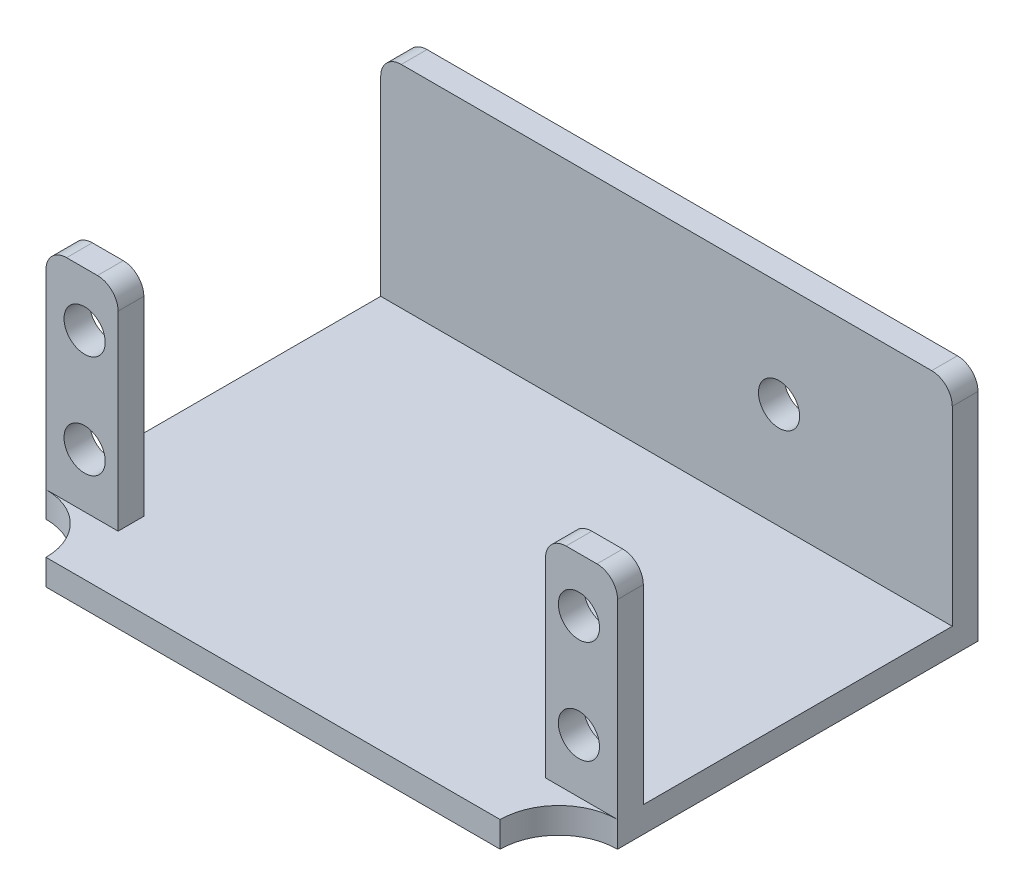
ISO-10303-21;
HEADER;
FILE_DESCRIPTION(('STEP AP214'),'2;1');
FILE_NAME('part.step','',(''),(''),'','','');
FILE_SCHEMA(('AUTOMOTIVE_DESIGN { 1 0 10303 214 1 1 1 1 }'));
ENDSEC;
DATA;
#1=APPLICATION_CONTEXT('core data for automotive mechanical design processes');
#2=APPLICATION_PROTOCOL_DEFINITION('international standard','automotive_design',2000,#1);
#3=PRODUCT_CONTEXT('',#1,'mechanical');
#4=PRODUCT('Part','Part','',(#3));
#5=PRODUCT_RELATED_PRODUCT_CATEGORY('part','',(#4));
#6=PRODUCT_DEFINITION_FORMATION('','',#4);
#7=PRODUCT_DEFINITION_CONTEXT('part definition',#1,'design');
#8=PRODUCT_DEFINITION('design','',#6,#7);
#9=PRODUCT_DEFINITION_SHAPE('','',#8);
#10=(LENGTH_UNIT() NAMED_UNIT(*) SI_UNIT(.MILLI.,.METRE.));
#11=(NAMED_UNIT(*) PLANE_ANGLE_UNIT() SI_UNIT($,.RADIAN.));
#12=(NAMED_UNIT(*) SI_UNIT($,.STERADIAN.) SOLID_ANGLE_UNIT());
#13=UNCERTAINTY_MEASURE_WITH_UNIT(LENGTH_MEASURE(1.E-05),#10,'distance_accuracy_value','');
#14=(GEOMETRIC_REPRESENTATION_CONTEXT(3) GLOBAL_UNCERTAINTY_ASSIGNED_CONTEXT((#13)) GLOBAL_UNIT_ASSIGNED_CONTEXT((#10,
#11,#12)) REPRESENTATION_CONTEXT('',''));
#15=CARTESIAN_POINT('',(0.,0.,0.));
#16=DIRECTION('',(0.,0.,1.));
#17=DIRECTION('',(1.,0.,0.));
#18=AXIS2_PLACEMENT_3D('',#15,#16,#17);
#19=CARTESIAN_POINT('',(0.,2.5,0.));
#20=DIRECTION('',(1.,0.,0.));
#21=DIRECTION('',(0.,0.,-1.));
#22=AXIS2_PLACEMENT_3D('',#19,#20,#21);
#23=PLANE('',#22);
#24=DIRECTION('',(0.,-1.,0.));
#25=VECTOR('',#24,1.);
#26=CARTESIAN_POINT('',(0.,2.5,-5.7));
#27=LINE('',#26,#25);
#28=CARTESIAN_POINT('',(0.,21.,-5.7));
#29=VERTEX_POINT('',#28);
#30=CARTESIAN_POINT('',(0.,2.5,-5.7));
#31=VERTEX_POINT('',#30);
#32=EDGE_CURVE('E256',#29,#31,#27,.T.);
#33=ORIENTED_EDGE('',*,*,#32,.F.);
#34=DIRECTION('',(0.,0.,-1.));
#35=VECTOR('',#34,1.);
#36=CARTESIAN_POINT('',(0.,21.,0.));
#37=LINE('',#36,#35);
#38=CARTESIAN_POINT('',(0.,21.,-8.2));
#39=VERTEX_POINT('',#38);
#40=EDGE_CURVE('E362',#29,#39,#37,.T.);
#41=ORIENTED_EDGE('',*,*,#40,.T.);
#42=DIRECTION('',(0.,-1.,0.));
#43=VECTOR('',#42,1.);
#44=CARTESIAN_POINT('',(0.,2.5,-8.2));
#45=LINE('',#44,#43);
#46=CARTESIAN_POINT('',(0.,2.5,-8.2));
#47=VERTEX_POINT('',#46);
#48=EDGE_CURVE('E255',#39,#47,#45,.T.);
#49=ORIENTED_EDGE('',*,*,#48,.T.);
#50=DIRECTION('',(0.,0.,1.));
#51=VECTOR('',#50,1.);
#52=CARTESIAN_POINT('',(0.,2.5,0.));
#53=LINE('',#52,#51);
#54=CARTESIAN_POINT('',(0.,2.5,-38.2));
#55=VERTEX_POINT('',#54);
#56=EDGE_CURVE('E289',#55,#47,#53,.T.);
#57=ORIENTED_EDGE('',*,*,#56,.F.);
#58=DIRECTION('',(0.,-1.,0.));
#59=VECTOR('',#58,1.);
#60=CARTESIAN_POINT('',(0.,78.5562777730834,-38.2));
#61=LINE('',#60,#59);
#62=CARTESIAN_POINT('',(0.,21.,-38.2));
#63=VERTEX_POINT('',#62);
#64=EDGE_CURVE('E404',#63,#55,#61,.T.);
#65=ORIENTED_EDGE('',*,*,#64,.F.);
#66=DIRECTION('',(0.,0.,-1.));
#67=VECTOR('',#66,1.);
#68=CARTESIAN_POINT('',(0.,21.,0.));
#69=LINE('',#68,#67);
#70=CARTESIAN_POINT('',(0.,21.,-40.7));
#71=VERTEX_POINT('',#70);
#72=EDGE_CURVE('E358',#63,#71,#69,.T.);
#73=ORIENTED_EDGE('',*,*,#72,.T.);
#74=DIRECTION('',(0.,-1.,0.));
#75=VECTOR('',#74,1.);
#76=CARTESIAN_POINT('',(0.,78.5562777730834,-40.7));
#77=LINE('',#76,#75);
#78=CARTESIAN_POINT('',(0.,0.,-40.7));
#79=VERTEX_POINT('',#78);
#80=EDGE_CURVE('E401',#71,#79,#77,.T.);
#81=ORIENTED_EDGE('',*,*,#80,.T.);
#82=DIRECTION('',(0.,0.,1.));
#83=VECTOR('',#82,1.);
#84=CARTESIAN_POINT('',(0.,0.,0.));
#85=LINE('',#84,#83);
#86=CARTESIAN_POINT('',(0.,0.,-5.7));
#87=VERTEX_POINT('',#86);
#88=EDGE_CURVE('E288',#79,#87,#85,.T.);
#89=ORIENTED_EDGE('',*,*,#88,.T.);
#90=DIRECTION('',(0.,1.,0.));
#91=VECTOR('',#90,1.);
#92=CARTESIAN_POINT('',(0.,0.,-5.7));
#93=LINE('',#92,#91);
#94=EDGE_CURVE('E416',#87,#31,#93,.T.);
#95=ORIENTED_EDGE('',*,*,#94,.T.);
#96=EDGE_LOOP('',(#33,#41,#49,#57,#65,#73,#81,#89,#95));
#97=FACE_BOUND('',#96,.T.);
#98=ADVANCED_FACE('F41',(#97),#23,.F.);
#99=CARTESIAN_POINT('',(0.,2.5,0.));
#100=DIRECTION('',(0.,0.,-1.));
#101=DIRECTION('',(-1.,0.,0.));
#102=AXIS2_PLACEMENT_3D('',#99,#100,#101);
#103=PLANE('',#102);
#104=DIRECTION('',(1.,0.,0.));
#105=VECTOR('',#104,1.);
#106=CARTESIAN_POINT('',(0.,2.5,0.));
#107=LINE('',#106,#105);
#108=CARTESIAN_POINT('',(5.7,2.5,0.));
#109=VERTEX_POINT('',#108);
#110=CARTESIAN_POINT('',(49.8,2.5,0.));
#111=VERTEX_POINT('',#110);
#112=EDGE_CURVE('E210',#109,#111,#107,.T.);
#113=ORIENTED_EDGE('',*,*,#112,.F.);
#114=DIRECTION('',(0.,1.,0.));
#115=VECTOR('',#114,1.);
#116=CARTESIAN_POINT('',(5.7,0.,0.));
#117=LINE('',#116,#115);
#118=CARTESIAN_POINT('',(5.7,0.,0.));
#119=VERTEX_POINT('',#118);
#120=EDGE_CURVE('E490',#109,#119,#117,.F.);
#121=ORIENTED_EDGE('',*,*,#120,.T.);
#122=DIRECTION('',(1.,0.,0.));
#123=VECTOR('',#122,1.);
#124=CARTESIAN_POINT('',(0.,0.,0.));
#125=LINE('',#124,#123);
#126=CARTESIAN_POINT('',(49.8,0.,0.));
#127=VERTEX_POINT('',#126);
#128=EDGE_CURVE('E308',#119,#127,#125,.T.);
#129=ORIENTED_EDGE('',*,*,#128,.T.);
#130=DIRECTION('',(0.,1.,0.));
#131=VECTOR('',#130,1.);
#132=CARTESIAN_POINT('',(49.8,0.,0.));
#133=LINE('',#132,#131);
#134=EDGE_CURVE('E196',#127,#111,#133,.T.);
#135=ORIENTED_EDGE('',*,*,#134,.T.);
#136=EDGE_LOOP('',(#113,#121,#129,#135));
#137=FACE_BOUND('',#136,.T.);
#138=ADVANCED_FACE('F506',(#137),#103,.F.);
#139=CARTESIAN_POINT('',(55.5,2.5,0.));
#140=DIRECTION('',(-1.,0.,0.));
#141=DIRECTION('',(0.,0.,1.));
#142=AXIS2_PLACEMENT_3D('',#139,#140,#141);
#143=PLANE('',#142);
#144=DIRECTION('',(0.,1.,0.));
#145=VECTOR('',#144,1.);
#146=CARTESIAN_POINT('',(55.5,2.5,-8.2));
#147=LINE('',#146,#145);
#148=CARTESIAN_POINT('',(55.5,2.5,-8.2));
#149=VERTEX_POINT('',#148);
#150=CARTESIAN_POINT('',(55.5,21.,-8.2));
#151=VERTEX_POINT('',#150);
#152=EDGE_CURVE('E243',#149,#151,#147,.T.);
#153=ORIENTED_EDGE('',*,*,#152,.T.);
#154=DIRECTION('',(0.,0.,-1.));
#155=VECTOR('',#154,1.);
#156=CARTESIAN_POINT('',(55.5,21.,0.));
#157=LINE('',#156,#155);
#158=CARTESIAN_POINT('',(55.5,21.,-5.7));
#159=VERTEX_POINT('',#158);
#160=EDGE_CURVE('E227',#151,#159,#157,.F.);
#161=ORIENTED_EDGE('',*,*,#160,.T.);
#162=DIRECTION('',(0.,1.,0.));
#163=VECTOR('',#162,1.);
#164=CARTESIAN_POINT('',(55.5,2.5,-5.7));
#165=LINE('',#164,#163);
#166=CARTESIAN_POINT('',(55.5,2.5,-5.7));
#167=VERTEX_POINT('',#166);
#168=EDGE_CURVE('E217',#167,#159,#165,.T.);
#169=ORIENTED_EDGE('',*,*,#168,.F.);
#170=DIRECTION('',(0.,1.,0.));
#171=VECTOR('',#170,1.);
#172=CARTESIAN_POINT('',(55.5,0.,-5.7));
#173=LINE('',#172,#171);
#174=CARTESIAN_POINT('',(55.5,0.,-5.7));
#175=VERTEX_POINT('',#174);
#176=EDGE_CURVE('E184',#167,#175,#173,.F.);
#177=ORIENTED_EDGE('',*,*,#176,.T.);
#178=DIRECTION('',(0.,0.,-1.));
#179=VECTOR('',#178,1.);
#180=CARTESIAN_POINT('',(55.5,0.,0.));
#181=LINE('',#180,#179);
#182=CARTESIAN_POINT('',(55.5,0.,-40.7));
#183=VERTEX_POINT('',#182);
#184=EDGE_CURVE('E293',#175,#183,#181,.T.);
#185=ORIENTED_EDGE('',*,*,#184,.T.);
#186=DIRECTION('',(0.,-1.,0.));
#187=VECTOR('',#186,1.);
#188=CARTESIAN_POINT('',(55.5,78.5562777730834,-40.7));
#189=LINE('',#188,#187);
#190=CARTESIAN_POINT('',(55.5,21.,-40.7));
#191=VERTEX_POINT('',#190);
#192=EDGE_CURVE('E410',#191,#183,#189,.T.);
#193=ORIENTED_EDGE('',*,*,#192,.F.);
#194=DIRECTION('',(0.,0.,1.));
#195=VECTOR('',#194,1.);
#196=CARTESIAN_POINT('',(55.5,21.,0.));
#197=LINE('',#196,#195);
#198=CARTESIAN_POINT('',(55.5,21.,-38.2));
#199=VERTEX_POINT('',#198);
#200=EDGE_CURVE('E366',#191,#199,#197,.T.);
#201=ORIENTED_EDGE('',*,*,#200,.T.);
#202=DIRECTION('',(0.,-1.,0.));
#203=VECTOR('',#202,1.);
#204=CARTESIAN_POINT('',(55.5,78.5562777730834,-38.2));
#205=LINE('',#204,#203);
#206=CARTESIAN_POINT('',(55.5,2.5,-38.2));
#207=VERTEX_POINT('',#206);
#208=EDGE_CURVE('E414',#199,#207,#205,.T.);
#209=ORIENTED_EDGE('',*,*,#208,.T.);
#210=DIRECTION('',(0.,0.,-1.));
#211=VECTOR('',#210,1.);
#212=CARTESIAN_POINT('',(55.5,2.5,0.));
#213=LINE('',#212,#211);
#214=EDGE_CURVE('E296',#149,#207,#213,.T.);
#215=ORIENTED_EDGE('',*,*,#214,.F.);
#216=EDGE_LOOP('',(#153,#161,#169,#177,#185,#193,#201,#209,#215));
#217=FACE_BOUND('',#216,.T.);
#218=ADVANCED_FACE('F225',(#217),#143,.F.);
#219=CARTESIAN_POINT('',(0.,2.5,0.));
#220=DIRECTION('',(0.,-1.,0.));
#221=DIRECTION('',(0.,0.,-1.));
#222=AXIS2_PLACEMENT_3D('',#219,#220,#221);
#223=PLANE('',#222);
#224=DIRECTION('',(1.,0.,0.));
#225=VECTOR('',#224,1.);
#226=CARTESIAN_POINT('',(0.,2.5,-5.7));
#227=LINE('',#226,#225);
#228=CARTESIAN_POINT('',(7.,2.5,-5.7));
#229=VERTEX_POINT('',#228);
#230=EDGE_CURVE('E259',#31,#229,#227,.T.);
#231=ORIENTED_EDGE('',*,*,#230,.F.);
#232=CARTESIAN_POINT('',(0.,2.5,0.));
#233=DIRECTION('',(0.,1.,0.));
#234=DIRECTION('',(0.,0.,1.));
#235=AXIS2_PLACEMENT_3D('',#232,#233,#234);
#236=CIRCLE('',#235,5.7);
#237=EDGE_CURVE('E486',#109,#31,#236,.T.);
#238=ORIENTED_EDGE('',*,*,#237,.F.);
#239=ORIENTED_EDGE('',*,*,#112,.T.);
#240=CARTESIAN_POINT('',(55.5,2.5,0.));
#241=DIRECTION('',(0.,1.,0.));
#242=DIRECTION('',(0.,0.,1.));
#243=AXIS2_PLACEMENT_3D('',#240,#241,#242);
#244=CIRCLE('',#243,5.7);
#245=EDGE_CURVE('E187',#167,#111,#244,.T.);
#246=ORIENTED_EDGE('',*,*,#245,.F.);
#247=DIRECTION('',(1.,0.,0.));
#248=VECTOR('',#247,1.);
#249=CARTESIAN_POINT('',(55.5,2.5,-5.7));
#250=LINE('',#249,#248);
#251=CARTESIAN_POINT('',(48.5,2.5,-5.7));
#252=VERTEX_POINT('',#251);
#253=EDGE_CURVE('E206',#252,#167,#250,.T.);
#254=ORIENTED_EDGE('',*,*,#253,.F.);
#255=DIRECTION('',(0.,0.,-1.));
#256=VECTOR('',#255,1.);
#257=CARTESIAN_POINT('',(48.5,2.5,-5.7));
#258=LINE('',#257,#256);
#259=CARTESIAN_POINT('',(48.5,2.5,-8.2));
#260=VERTEX_POINT('',#259);
#261=EDGE_CURVE('E222',#252,#260,#258,.T.);
#262=ORIENTED_EDGE('',*,*,#261,.T.);
#263=DIRECTION('',(1.,0.,0.));
#264=VECTOR('',#263,1.);
#265=CARTESIAN_POINT('',(55.5,2.5,-8.2));
#266=LINE('',#265,#264);
#267=EDGE_CURVE('E230',#260,#149,#266,.T.);
#268=ORIENTED_EDGE('',*,*,#267,.T.);
#269=ORIENTED_EDGE('',*,*,#214,.T.);
#270=DIRECTION('',(-1.,0.,0.));
#271=VECTOR('',#270,1.);
#272=CARTESIAN_POINT('',(0.,2.5,-38.2));
#273=LINE('',#272,#271);
#274=EDGE_CURVE('E300',#207,#55,#273,.T.);
#275=ORIENTED_EDGE('',*,*,#274,.T.);
#276=ORIENTED_EDGE('',*,*,#56,.T.);
#277=DIRECTION('',(1.,0.,0.));
#278=VECTOR('',#277,1.);
#279=CARTESIAN_POINT('',(0.,2.5,-8.2));
#280=LINE('',#279,#278);
#281=CARTESIAN_POINT('',(7.,2.5,-8.2));
#282=VERTEX_POINT('',#281);
#283=EDGE_CURVE('E275',#47,#282,#280,.T.);
#284=ORIENTED_EDGE('',*,*,#283,.T.);
#285=DIRECTION('',(0.,0.,-1.));
#286=VECTOR('',#285,1.);
#287=CARTESIAN_POINT('',(7.,2.5,-5.7));
#288=LINE('',#287,#286);
#289=EDGE_CURVE('E272',#229,#282,#288,.T.);
#290=ORIENTED_EDGE('',*,*,#289,.F.);
#291=EDGE_LOOP('',(#231,#238,#239,#246,#254,#262,#268,#269,#275,#276,#284,#290));
#292=FACE_BOUND('',#291,.T.);
#293=ADVANCED_FACE('F204',(#292),#223,.F.);
#294=CARTESIAN_POINT('',(0.,0.,0.));
#295=DIRECTION('',(0.,-1.,0.));
#296=DIRECTION('',(0.,0.,-1.));
#297=AXIS2_PLACEMENT_3D('',#294,#295,#296);
#298=PLANE('',#297);
#299=CARTESIAN_POINT('',(0.,0.,0.));
#300=DIRECTION('',(0.,1.,0.));
#301=DIRECTION('',(0.,0.,1.));
#302=AXIS2_PLACEMENT_3D('',#299,#300,#301);
#303=CIRCLE('',#302,5.7);
#304=EDGE_CURVE('E197',#119,#87,#303,.T.);
#305=ORIENTED_EDGE('',*,*,#304,.T.);
#306=ORIENTED_EDGE('',*,*,#88,.F.);
#307=DIRECTION('',(-1.,0.,0.));
#308=VECTOR('',#307,1.);
#309=CARTESIAN_POINT('',(0.,0.,-40.7));
#310=LINE('',#309,#308);
#311=EDGE_CURVE('E408',#183,#79,#310,.T.);
#312=ORIENTED_EDGE('',*,*,#311,.F.);
#313=ORIENTED_EDGE('',*,*,#184,.F.);
#314=CARTESIAN_POINT('',(55.5,0.,0.));
#315=DIRECTION('',(0.,1.,0.));
#316=DIRECTION('',(0.,0.,1.));
#317=AXIS2_PLACEMENT_3D('',#314,#315,#316);
#318=CIRCLE('',#317,5.7);
#319=EDGE_CURVE('E190',#175,#127,#318,.T.);
#320=ORIENTED_EDGE('',*,*,#319,.T.);
#321=ORIENTED_EDGE('',*,*,#128,.F.);
#322=EDGE_LOOP('',(#305,#306,#312,#313,#320,#321));
#323=FACE_BOUND('',#322,.T.);
#324=ADVANCED_FACE('F508',(#323),#298,.T.);
#325=CARTESIAN_POINT('',(7.,2.5,-5.7));
#326=DIRECTION('',(-1.,0.,0.));
#327=DIRECTION('',(0.,0.,1.));
#328=AXIS2_PLACEMENT_3D('',#325,#326,#327);
#329=PLANE('',#328);
#330=DIRECTION('',(0.,1.,0.));
#331=VECTOR('',#330,1.);
#332=CARTESIAN_POINT('',(7.,2.5,-8.2));
#333=LINE('',#332,#331);
#334=CARTESIAN_POINT('',(7.,21.,-8.2));
#335=VERTEX_POINT('',#334);
#336=EDGE_CURVE('E278',#282,#335,#333,.T.);
#337=ORIENTED_EDGE('',*,*,#336,.T.);
#338=DIRECTION('',(0.,0.,-1.));
#339=VECTOR('',#338,1.);
#340=CARTESIAN_POINT('',(7.,21.,-5.7));
#341=LINE('',#340,#339);
#342=CARTESIAN_POINT('',(7.,21.,-5.7));
#343=VERTEX_POINT('',#342);
#344=EDGE_CURVE('E326',#335,#343,#341,.F.);
#345=ORIENTED_EDGE('',*,*,#344,.T.);
#346=DIRECTION('',(0.,1.,0.));
#347=VECTOR('',#346,1.);
#348=CARTESIAN_POINT('',(7.,2.5,-5.7));
#349=LINE('',#348,#347);
#350=EDGE_CURVE('E264',#229,#343,#349,.T.);
#351=ORIENTED_EDGE('',*,*,#350,.F.);
#352=ORIENTED_EDGE('',*,*,#289,.T.);
#353=EDGE_LOOP('',(#337,#345,#351,#352));
#354=FACE_BOUND('',#353,.T.);
#355=ADVANCED_FACE('F709',(#354),#329,.F.);
#356=CARTESIAN_POINT('',(0.,23.,-5.7));
#357=DIRECTION('',(0.,-1.,0.));
#358=DIRECTION('',(0.,0.,-1.));
#359=AXIS2_PLACEMENT_3D('',#356,#357,#358);
#360=PLANE('',#359);
#361=DIRECTION('',(-1.,0.,0.));
#362=VECTOR('',#361,1.);
#363=CARTESIAN_POINT('',(0.,23.,-5.7));
#364=LINE('',#363,#362);
#365=CARTESIAN_POINT('',(5.,23.,-5.7));
#366=VERTEX_POINT('',#365);
#367=CARTESIAN_POINT('',(2.,23.,-5.7));
#368=VERTEX_POINT('',#367);
#369=EDGE_CURVE('E268',#366,#368,#364,.T.);
#370=ORIENTED_EDGE('',*,*,#369,.F.);
#371=DIRECTION('',(0.,0.,-1.));
#372=VECTOR('',#371,1.);
#373=CARTESIAN_POINT('',(5.,23.,-5.7));
#374=LINE('',#373,#372);
#375=CARTESIAN_POINT('',(5.,23.,-8.2));
#376=VERTEX_POINT('',#375);
#377=EDGE_CURVE('E316',#366,#376,#374,.T.);
#378=ORIENTED_EDGE('',*,*,#377,.T.);
#379=DIRECTION('',(-1.,0.,0.));
#380=VECTOR('',#379,1.);
#381=CARTESIAN_POINT('',(0.,23.,-8.2));
#382=LINE('',#381,#380);
#383=CARTESIAN_POINT('',(2.,23.,-8.2));
#384=VERTEX_POINT('',#383);
#385=EDGE_CURVE('E260',#376,#384,#382,.T.);
#386=ORIENTED_EDGE('',*,*,#385,.T.);
#387=DIRECTION('',(0.,0.,-1.));
#388=VECTOR('',#387,1.);
#389=CARTESIAN_POINT('',(2.,23.,-5.7));
#390=LINE('',#389,#388);
#391=EDGE_CURVE('E304',#384,#368,#390,.F.);
#392=ORIENTED_EDGE('',*,*,#391,.T.);
#393=EDGE_LOOP('',(#370,#378,#386,#392));
#394=FACE_BOUND('',#393,.T.);
#395=ADVANCED_FACE('F461',(#394),#360,.F.);
#396=CARTESIAN_POINT('',(0.,0.,-5.7));
#397=DIRECTION('',(0.,0.,-1.));
#398=DIRECTION('',(-1.,0.,0.));
#399=AXIS2_PLACEMENT_3D('',#396,#397,#398);
#400=PLANE('',#399);
#401=CARTESIAN_POINT('',(3.75,7.75,-5.7));
#402=DIRECTION('',(0.,0.,1.));
#403=DIRECTION('',(-1.,0.,0.));
#404=AXIS2_PLACEMENT_3D('',#401,#402,#403);
#405=CIRCLE('',#404,2.);
#406=CARTESIAN_POINT('',(1.75,7.75,-5.7));
#407=VERTEX_POINT('',#406);
#408=EDGE_CURVE('E429',#407,#407,#405,.T.);
#409=ORIENTED_EDGE('',*,*,#408,.F.);
#410=EDGE_LOOP('',(#409));
#411=FACE_BOUND('',#410,.T.);
#412=CARTESIAN_POINT('',(3.75,17.75,-5.7));
#413=DIRECTION('',(0.,0.,1.));
#414=DIRECTION('',(1.,0.,0.));
#415=AXIS2_PLACEMENT_3D('',#412,#413,#414);
#416=CIRCLE('',#415,2.);
#417=CARTESIAN_POINT('',(5.75,17.75,-5.7));
#418=VERTEX_POINT('',#417);
#419=EDGE_CURVE('E238',#418,#418,#416,.T.);
#420=ORIENTED_EDGE('',*,*,#419,.F.);
#421=EDGE_LOOP('',(#420));
#422=FACE_BOUND('',#421,.T.);
#423=ORIENTED_EDGE('',*,*,#350,.T.);
#424=CARTESIAN_POINT('',(5.,21.,-5.7));
#425=DIRECTION('',(0.,0.,-1.));
#426=DIRECTION('',(-1.,0.,0.));
#427=AXIS2_PLACEMENT_3D('',#424,#425,#426);
#428=CIRCLE('',#427,2.);
#429=EDGE_CURVE('E332',#343,#366,#428,.F.);
#430=ORIENTED_EDGE('',*,*,#429,.T.);
#431=ORIENTED_EDGE('',*,*,#369,.T.);
#432=CARTESIAN_POINT('',(2.,21.,-5.7));
#433=DIRECTION('',(0.,0.,-1.));
#434=DIRECTION('',(-1.,0.,0.));
#435=AXIS2_PLACEMENT_3D('',#432,#433,#434);
#436=CIRCLE('',#435,2.);
#437=EDGE_CURVE('E329',#368,#29,#436,.F.);
#438=ORIENTED_EDGE('',*,*,#437,.T.);
#439=ORIENTED_EDGE('',*,*,#32,.T.);
#440=ORIENTED_EDGE('',*,*,#230,.T.);
#441=EDGE_LOOP('',(#423,#430,#431,#438,#439,#440));
#442=FACE_BOUND('',#441,.T.);
#443=ADVANCED_FACE('F457',(#411,#422,#442),#400,.F.);
#444=CARTESIAN_POINT('',(0.,0.,-8.2));
#445=DIRECTION('',(0.,0.,-1.));
#446=DIRECTION('',(-1.,0.,0.));
#447=AXIS2_PLACEMENT_3D('',#444,#445,#446);
#448=PLANE('',#447);
#449=CARTESIAN_POINT('',(3.75,7.75,-8.2));
#450=DIRECTION('',(0.,0.,1.));
#451=DIRECTION('',(-1.,0.,0.));
#452=AXIS2_PLACEMENT_3D('',#449,#450,#451);
#453=CIRCLE('',#452,2.);
#454=CARTESIAN_POINT('',(1.75,7.75,-8.2));
#455=VERTEX_POINT('',#454);
#456=EDGE_CURVE('E425',#455,#455,#453,.T.);
#457=ORIENTED_EDGE('',*,*,#456,.T.);
#458=EDGE_LOOP('',(#457));
#459=FACE_BOUND('',#458,.T.);
#460=CARTESIAN_POINT('',(3.75,17.75,-8.2));
#461=DIRECTION('',(0.,0.,1.));
#462=DIRECTION('',(1.,0.,0.));
#463=AXIS2_PLACEMENT_3D('',#460,#461,#462);
#464=CIRCLE('',#463,2.);
#465=CARTESIAN_POINT('',(5.75,17.75,-8.2));
#466=VERTEX_POINT('',#465);
#467=EDGE_CURVE('E247',#466,#466,#464,.T.);
#468=ORIENTED_EDGE('',*,*,#467,.T.);
#469=EDGE_LOOP('',(#468));
#470=FACE_BOUND('',#469,.T.);
#471=ORIENTED_EDGE('',*,*,#385,.F.);
#472=CARTESIAN_POINT('',(5.,21.,-8.2));
#473=DIRECTION('',(0.,0.,-1.));
#474=DIRECTION('',(-1.,0.,0.));
#475=AXIS2_PLACEMENT_3D('',#472,#473,#474);
#476=CIRCLE('',#475,2.);
#477=EDGE_CURVE('E323',#376,#335,#476,.T.);
#478=ORIENTED_EDGE('',*,*,#477,.T.);
#479=ORIENTED_EDGE('',*,*,#336,.F.);
#480=ORIENTED_EDGE('',*,*,#283,.F.);
#481=ORIENTED_EDGE('',*,*,#48,.F.);
#482=CARTESIAN_POINT('',(2.,21.,-8.2));
#483=DIRECTION('',(0.,0.,-1.));
#484=DIRECTION('',(-1.,0.,0.));
#485=AXIS2_PLACEMENT_3D('',#482,#483,#484);
#486=CIRCLE('',#485,2.);
#487=EDGE_CURVE('E320',#39,#384,#486,.T.);
#488=ORIENTED_EDGE('',*,*,#487,.T.);
#489=EDGE_LOOP('',(#471,#478,#479,#480,#481,#488));
#490=FACE_BOUND('',#489,.T.);
#491=ADVANCED_FACE('F460',(#459,#470,#490),#448,.T.);
#492=CARTESIAN_POINT('',(55.5,23.,-5.7));
#493=DIRECTION('',(0.,-1.,0.));
#494=DIRECTION('',(0.,0.,-1.));
#495=AXIS2_PLACEMENT_3D('',#492,#493,#494);
#496=PLANE('',#495);
#497=DIRECTION('',(-1.,0.,0.));
#498=VECTOR('',#497,1.);
#499=CARTESIAN_POINT('',(55.5,23.,-8.2));
#500=LINE('',#499,#498);
#501=CARTESIAN_POINT('',(53.5,23.,-8.2));
#502=VERTEX_POINT('',#501);
#503=CARTESIAN_POINT('',(50.5,23.,-8.2));
#504=VERTEX_POINT('',#503);
#505=EDGE_CURVE('E246',#502,#504,#500,.T.);
#506=ORIENTED_EDGE('',*,*,#505,.T.);
#507=DIRECTION('',(0.,0.,-1.));
#508=VECTOR('',#507,1.);
#509=CARTESIAN_POINT('',(50.5,23.,-5.7));
#510=LINE('',#509,#508);
#511=CARTESIAN_POINT('',(50.5,23.,-5.7));
#512=VERTEX_POINT('',#511);
#513=EDGE_CURVE('E349',#504,#512,#510,.F.);
#514=ORIENTED_EDGE('',*,*,#513,.T.);
#515=DIRECTION('',(-1.,0.,0.));
#516=VECTOR('',#515,1.);
#517=CARTESIAN_POINT('',(55.5,23.,-5.7));
#518=LINE('',#517,#516);
#519=CARTESIAN_POINT('',(53.5,23.,-5.7));
#520=VERTEX_POINT('',#519);
#521=EDGE_CURVE('E229',#520,#512,#518,.T.);
#522=ORIENTED_EDGE('',*,*,#521,.F.);
#523=DIRECTION('',(0.,0.,-1.));
#524=VECTOR('',#523,1.);
#525=CARTESIAN_POINT('',(53.5,23.,-5.7));
#526=LINE('',#525,#524);
#527=EDGE_CURVE('E345',#520,#502,#526,.T.);
#528=ORIENTED_EDGE('',*,*,#527,.T.);
#529=EDGE_LOOP('',(#506,#514,#522,#528));
#530=FACE_BOUND('',#529,.T.);
#531=ADVANCED_FACE('F683',(#530),#496,.F.);
#532=CARTESIAN_POINT('',(48.5,2.5,-5.7));
#533=DIRECTION('',(1.,0.,0.));
#534=DIRECTION('',(0.,0.,-1.));
#535=AXIS2_PLACEMENT_3D('',#532,#533,#534);
#536=PLANE('',#535);
#537=DIRECTION('',(0.,-1.,0.));
#538=VECTOR('',#537,1.);
#539=CARTESIAN_POINT('',(48.5,2.5,-5.7));
#540=LINE('',#539,#538);
#541=CARTESIAN_POINT('',(48.5,21.,-5.7));
#542=VERTEX_POINT('',#541);
#543=EDGE_CURVE('E220',#542,#252,#540,.T.);
#544=ORIENTED_EDGE('',*,*,#543,.F.);
#545=DIRECTION('',(0.,0.,-1.));
#546=VECTOR('',#545,1.);
#547=CARTESIAN_POINT('',(48.5,21.,-5.7));
#548=LINE('',#547,#546);
#549=CARTESIAN_POINT('',(48.5,21.,-8.2));
#550=VERTEX_POINT('',#549);
#551=EDGE_CURVE('E335',#542,#550,#548,.T.);
#552=ORIENTED_EDGE('',*,*,#551,.T.);
#553=DIRECTION('',(0.,-1.,0.));
#554=VECTOR('',#553,1.);
#555=CARTESIAN_POINT('',(48.5,2.5,-8.2));
#556=LINE('',#555,#554);
#557=EDGE_CURVE('E235',#550,#260,#556,.T.);
#558=ORIENTED_EDGE('',*,*,#557,.T.);
#559=ORIENTED_EDGE('',*,*,#261,.F.);
#560=EDGE_LOOP('',(#544,#552,#558,#559));
#561=FACE_BOUND('',#560,.T.);
#562=ADVANCED_FACE('F675',(#561),#536,.F.);
#563=CARTESIAN_POINT('',(0.,0.,-5.7));
#564=DIRECTION('',(0.,0.,1.));
#565=DIRECTION('',(1.,0.,0.));
#566=AXIS2_PLACEMENT_3D('',#563,#564,#565);
#567=PLANE('',#566);
#568=CARTESIAN_POINT('',(51.75,17.75,-5.7));
#569=DIRECTION('',(0.,0.,1.));
#570=DIRECTION('',(-1.,0.,0.));
#571=AXIS2_PLACEMENT_3D('',#568,#569,#570);
#572=CIRCLE('',#571,2.);
#573=CARTESIAN_POINT('',(49.75,17.75,-5.7));
#574=VERTEX_POINT('',#573);
#575=EDGE_CURVE('E396',#574,#574,#572,.T.);
#576=ORIENTED_EDGE('',*,*,#575,.F.);
#577=EDGE_LOOP('',(#576));
#578=FACE_BOUND('',#577,.T.);
#579=CARTESIAN_POINT('',(51.75,7.75,-5.7));
#580=DIRECTION('',(0.,0.,1.));
#581=DIRECTION('',(1.,0.,0.));
#582=AXIS2_PLACEMENT_3D('',#579,#580,#581);
#583=CIRCLE('',#582,2.);
#584=CARTESIAN_POINT('',(53.75,7.75,-5.7));
#585=VERTEX_POINT('',#584);
#586=EDGE_CURVE('E437',#585,#585,#583,.T.);
#587=ORIENTED_EDGE('',*,*,#586,.F.);
#588=EDGE_LOOP('',(#587));
#589=FACE_BOUND('',#588,.T.);
#590=ORIENTED_EDGE('',*,*,#521,.T.);
#591=CARTESIAN_POINT('',(50.5,21.,-5.7));
#592=DIRECTION('',(0.,0.,1.));
#593=DIRECTION('',(1.,0.,0.));
#594=AXIS2_PLACEMENT_3D('',#591,#592,#593);
#595=CIRCLE('',#594,2.);
#596=EDGE_CURVE('E355',#512,#542,#595,.T.);
#597=ORIENTED_EDGE('',*,*,#596,.T.);
#598=ORIENTED_EDGE('',*,*,#543,.T.);
#599=ORIENTED_EDGE('',*,*,#253,.T.);
#600=ORIENTED_EDGE('',*,*,#168,.T.);
#601=CARTESIAN_POINT('',(53.5,21.,-5.7));
#602=DIRECTION('',(0.,0.,1.));
#603=DIRECTION('',(1.,0.,0.));
#604=AXIS2_PLACEMENT_3D('',#601,#602,#603);
#605=CIRCLE('',#604,2.);
#606=EDGE_CURVE('E352',#159,#520,#605,.T.);
#607=ORIENTED_EDGE('',*,*,#606,.T.);
#608=EDGE_LOOP('',(#590,#597,#598,#599,#600,#607));
#609=FACE_BOUND('',#608,.T.);
#610=ADVANCED_FACE('F216',(#578,#589,#609),#567,.T.);
#611=CARTESIAN_POINT('',(0.,0.,-8.2));
#612=DIRECTION('',(0.,0.,1.));
#613=DIRECTION('',(1.,0.,0.));
#614=AXIS2_PLACEMENT_3D('',#611,#612,#613);
#615=PLANE('',#614);
#616=CARTESIAN_POINT('',(51.75,17.75,-8.2));
#617=DIRECTION('',(0.,0.,1.));
#618=DIRECTION('',(-1.,0.,0.));
#619=AXIS2_PLACEMENT_3D('',#616,#617,#618);
#620=CIRCLE('',#619,2.);
#621=CARTESIAN_POINT('',(49.75,17.75,-8.2));
#622=VERTEX_POINT('',#621);
#623=EDGE_CURVE('E441',#622,#622,#620,.T.);
#624=ORIENTED_EDGE('',*,*,#623,.T.);
#625=EDGE_LOOP('',(#624));
#626=FACE_BOUND('',#625,.T.);
#627=CARTESIAN_POINT('',(51.75,7.75,-8.2));
#628=DIRECTION('',(0.,0.,1.));
#629=DIRECTION('',(1.,0.,0.));
#630=AXIS2_PLACEMENT_3D('',#627,#628,#629);
#631=CIRCLE('',#630,2.);
#632=CARTESIAN_POINT('',(53.75,7.75,-8.2));
#633=VERTEX_POINT('',#632);
#634=EDGE_CURVE('E433',#633,#633,#631,.T.);
#635=ORIENTED_EDGE('',*,*,#634,.T.);
#636=EDGE_LOOP('',(#635));
#637=FACE_BOUND('',#636,.T.);
#638=ORIENTED_EDGE('',*,*,#557,.F.);
#639=CARTESIAN_POINT('',(50.5,21.,-8.2));
#640=DIRECTION('',(0.,0.,1.));
#641=DIRECTION('',(1.,0.,0.));
#642=AXIS2_PLACEMENT_3D('',#639,#640,#641);
#643=CIRCLE('',#642,2.);
#644=EDGE_CURVE('E342',#550,#504,#643,.F.);
#645=ORIENTED_EDGE('',*,*,#644,.T.);
#646=ORIENTED_EDGE('',*,*,#505,.F.);
#647=CARTESIAN_POINT('',(53.5,21.,-8.2));
#648=DIRECTION('',(0.,0.,1.));
#649=DIRECTION('',(1.,0.,0.));
#650=AXIS2_PLACEMENT_3D('',#647,#648,#649);
#651=CIRCLE('',#650,2.);
#652=EDGE_CURVE('E339',#502,#151,#651,.F.);
#653=ORIENTED_EDGE('',*,*,#652,.T.);
#654=ORIENTED_EDGE('',*,*,#152,.F.);
#655=ORIENTED_EDGE('',*,*,#267,.F.);
#656=EDGE_LOOP('',(#638,#645,#646,#653,#654,#655));
#657=FACE_BOUND('',#656,.T.);
#658=ADVANCED_FACE('F661',(#626,#637,#657),#615,.F.);
#659=CARTESIAN_POINT('',(51.75,7.75,-8.2));
#660=DIRECTION('',(0.,0.,1.));
#661=DIRECTION('',(1.,0.,0.));
#662=AXIS2_PLACEMENT_3D('',#659,#660,#661);
#663=CYLINDRICAL_SURFACE('',#662,2.);
#664=ORIENTED_EDGE('',*,*,#634,.F.);
#665=EDGE_LOOP('',(#664));
#666=FACE_BOUND('',#665,.T.);
#667=ORIENTED_EDGE('',*,*,#586,.T.);
#668=EDGE_LOOP('',(#667));
#669=FACE_BOUND('',#668,.T.);
#670=ADVANCED_FACE('F653',(#666,#669),#663,.F.);
#671=CARTESIAN_POINT('',(51.75,17.75,-8.2));
#672=DIRECTION('',(0.,0.,1.));
#673=DIRECTION('',(1.,0.,0.));
#674=AXIS2_PLACEMENT_3D('',#671,#672,#673);
#675=CYLINDRICAL_SURFACE('',#674,2.);
#676=ORIENTED_EDGE('',*,*,#623,.F.);
#677=EDGE_LOOP('',(#676));
#678=FACE_BOUND('',#677,.T.);
#679=ORIENTED_EDGE('',*,*,#575,.T.);
#680=EDGE_LOOP('',(#679));
#681=FACE_BOUND('',#680,.T.);
#682=ADVANCED_FACE('F645',(#678,#681),#675,.F.);
#683=CARTESIAN_POINT('',(3.75,17.75,-8.2));
#684=DIRECTION('',(0.,0.,1.));
#685=DIRECTION('',(1.,0.,0.));
#686=AXIS2_PLACEMENT_3D('',#683,#684,#685);
#687=CYLINDRICAL_SURFACE('',#686,2.);
#688=ORIENTED_EDGE('',*,*,#467,.F.);
#689=EDGE_LOOP('',(#688));
#690=FACE_BOUND('',#689,.T.);
#691=ORIENTED_EDGE('',*,*,#419,.T.);
#692=EDGE_LOOP('',(#691));
#693=FACE_BOUND('',#692,.T.);
#694=ADVANCED_FACE('F455',(#690,#693),#687,.F.);
#695=CARTESIAN_POINT('',(3.75,7.75,-8.2));
#696=DIRECTION('',(0.,0.,1.));
#697=DIRECTION('',(1.,0.,0.));
#698=AXIS2_PLACEMENT_3D('',#695,#696,#697);
#699=CYLINDRICAL_SURFACE('',#698,2.);
#700=ORIENTED_EDGE('',*,*,#456,.F.);
#701=EDGE_LOOP('',(#700));
#702=FACE_BOUND('',#701,.T.);
#703=ORIENTED_EDGE('',*,*,#408,.T.);
#704=EDGE_LOOP('',(#703));
#705=FACE_BOUND('',#704,.T.);
#706=ADVANCED_FACE('F575',(#702,#705),#699,.F.);
#707=CARTESIAN_POINT('',(0.,78.5562777730834,-40.7));
#708=DIRECTION('',(0.,0.,1.));
#709=DIRECTION('',(1.,0.,0.));
#710=AXIS2_PLACEMENT_3D('',#707,#708,#709);
#711=PLANE('',#710);
#712=CARTESIAN_POINT('',(38.68100849,12.75,-40.7));
#713=DIRECTION('',(0.,0.,-1.));
#714=DIRECTION('',(1.,0.,0.));
#715=AXIS2_PLACEMENT_3D('',#712,#713,#714);
#716=CIRCLE('',#715,2.);
#717=CARTESIAN_POINT('',(40.68100849,12.75,-40.7));
#718=VERTEX_POINT('',#717);
#719=EDGE_CURVE('E814',#718,#718,#716,.T.);
#720=ORIENTED_EDGE('',*,*,#719,.F.);
#721=EDGE_LOOP('',(#720));
#722=FACE_BOUND('',#721,.T.);
#723=DIRECTION('',(1.,0.,0.));
#724=VECTOR('',#723,1.);
#725=CARTESIAN_POINT('',(0.,23.,-40.7));
#726=LINE('',#725,#724);
#727=CARTESIAN_POINT('',(2.,23.,-40.7));
#728=VERTEX_POINT('',#727);
#729=CARTESIAN_POINT('',(53.5,23.,-40.7));
#730=VERTEX_POINT('',#729);
#731=EDGE_CURVE('E388',#728,#730,#726,.T.);
#732=ORIENTED_EDGE('',*,*,#731,.T.);
#733=CARTESIAN_POINT('',(53.5,21.,-40.7));
#734=DIRECTION('',(0.,0.,1.));
#735=DIRECTION('',(1.,0.,0.));
#736=AXIS2_PLACEMENT_3D('',#733,#734,#735);
#737=CIRCLE('',#736,2.);
#738=EDGE_CURVE('E11',#730,#191,#737,.F.);
#739=ORIENTED_EDGE('',*,*,#738,.T.);
#740=ORIENTED_EDGE('',*,*,#192,.T.);
#741=ORIENTED_EDGE('',*,*,#311,.T.);
#742=ORIENTED_EDGE('',*,*,#80,.F.);
#743=CARTESIAN_POINT('',(2.,21.,-40.7));
#744=DIRECTION('',(0.,0.,1.));
#745=DIRECTION('',(1.,0.,0.));
#746=AXIS2_PLACEMENT_3D('',#743,#744,#745);
#747=CIRCLE('',#746,2.);
#748=EDGE_CURVE('E51',#71,#728,#747,.F.);
#749=ORIENTED_EDGE('',*,*,#748,.T.);
#750=EDGE_LOOP('',(#732,#739,#740,#741,#742,#749));
#751=FACE_BOUND('',#750,.T.);
#752=ADVANCED_FACE('F406',(#722,#751),#711,.F.);
#753=CARTESIAN_POINT('',(0.,78.5562777730834,-38.2));
#754=DIRECTION('',(0.,0.,-1.));
#755=DIRECTION('',(-1.,0.,0.));
#756=AXIS2_PLACEMENT_3D('',#753,#754,#755);
#757=PLANE('',#756);
#758=CARTESIAN_POINT('',(38.68100849,12.75,-38.2));
#759=DIRECTION('',(0.,0.,-1.));
#760=DIRECTION('',(-1.,0.,0.));
#761=AXIS2_PLACEMENT_3D('',#758,#759,#760);
#762=CIRCLE('',#761,2.);
#763=CARTESIAN_POINT('',(36.68100849,12.75,-38.2));
#764=VERTEX_POINT('',#763);
#765=EDGE_CURVE('E45',#764,#764,#762,.T.);
#766=ORIENTED_EDGE('',*,*,#765,.T.);
#767=EDGE_LOOP('',(#766));
#768=FACE_BOUND('',#767,.T.);
#769=ORIENTED_EDGE('',*,*,#208,.F.);
#770=CARTESIAN_POINT('',(53.5,21.,-38.2));
#771=DIRECTION('',(0.,0.,-1.));
#772=DIRECTION('',(-1.,0.,0.));
#773=AXIS2_PLACEMENT_3D('',#770,#771,#772);
#774=CIRCLE('',#773,2.);
#775=CARTESIAN_POINT('',(53.5,23.,-38.2));
#776=VERTEX_POINT('',#775);
#777=EDGE_CURVE('E375',#199,#776,#774,.F.);
#778=ORIENTED_EDGE('',*,*,#777,.T.);
#779=DIRECTION('',(-1.,0.,0.));
#780=VECTOR('',#779,1.);
#781=CARTESIAN_POINT('',(0.,23.,-38.2));
#782=LINE('',#781,#780);
#783=CARTESIAN_POINT('',(2.,23.,-38.2));
#784=VERTEX_POINT('',#783);
#785=EDGE_CURVE('E387',#776,#784,#782,.T.);
#786=ORIENTED_EDGE('',*,*,#785,.T.);
#787=CARTESIAN_POINT('',(2.,21.,-38.2));
#788=DIRECTION('',(0.,0.,-1.));
#789=DIRECTION('',(-1.,0.,0.));
#790=AXIS2_PLACEMENT_3D('',#787,#788,#789);
#791=CIRCLE('',#790,2.);
#792=EDGE_CURVE('E372',#784,#63,#791,.F.);
#793=ORIENTED_EDGE('',*,*,#792,.T.);
#794=ORIENTED_EDGE('',*,*,#64,.T.);
#795=ORIENTED_EDGE('',*,*,#274,.F.);
#796=EDGE_LOOP('',(#769,#778,#786,#793,#794,#795));
#797=FACE_BOUND('',#796,.T.);
#798=ADVANCED_FACE('F393',(#768,#797),#757,.F.);
#799=CARTESIAN_POINT('',(0.,23.,-5.7));
#800=DIRECTION('',(0.,-1.,0.));
#801=DIRECTION('',(0.,0.,-1.));
#802=AXIS2_PLACEMENT_3D('',#799,#800,#801);
#803=PLANE('',#802);
#804=ORIENTED_EDGE('',*,*,#785,.F.);
#805=DIRECTION('',(0.,0.,1.));
#806=VECTOR('',#805,1.);
#807=CARTESIAN_POINT('',(53.5,23.,-5.7));
#808=LINE('',#807,#806);
#809=EDGE_CURVE('E58',#776,#730,#808,.F.);
#810=ORIENTED_EDGE('',*,*,#809,.T.);
#811=ORIENTED_EDGE('',*,*,#731,.F.);
#812=DIRECTION('',(0.,0.,-1.));
#813=VECTOR('',#812,1.);
#814=CARTESIAN_POINT('',(2.,23.,-5.7));
#815=LINE('',#814,#813);
#816=EDGE_CURVE('E378',#728,#784,#815,.F.);
#817=ORIENTED_EDGE('',*,*,#816,.T.);
#818=EDGE_LOOP('',(#804,#810,#811,#817));
#819=FACE_BOUND('',#818,.T.);
#820=ADVANCED_FACE('F386',(#819),#803,.F.);
#821=CARTESIAN_POINT('',(55.5,0.,0.));
#822=DIRECTION('',(0.,1.,0.));
#823=DIRECTION('',(0.,0.,1.));
#824=AXIS2_PLACEMENT_3D('',#821,#822,#823);
#825=CYLINDRICAL_SURFACE('',#824,5.7);
#826=ORIENTED_EDGE('',*,*,#319,.F.);
#827=ORIENTED_EDGE('',*,*,#176,.F.);
#828=ORIENTED_EDGE('',*,*,#245,.T.);
#829=ORIENTED_EDGE('',*,*,#134,.F.);
#830=EDGE_LOOP('',(#826,#827,#828,#829));
#831=FACE_BOUND('',#830,.T.);
#832=ADVANCED_FACE('F186',(#831),#825,.F.);
#833=CARTESIAN_POINT('',(0.,0.,0.));
#834=DIRECTION('',(0.,1.,0.));
#835=DIRECTION('',(0.,0.,1.));
#836=AXIS2_PLACEMENT_3D('',#833,#834,#835);
#837=CYLINDRICAL_SURFACE('',#836,5.7);
#838=ORIENTED_EDGE('',*,*,#304,.F.);
#839=ORIENTED_EDGE('',*,*,#120,.F.);
#840=ORIENTED_EDGE('',*,*,#237,.T.);
#841=ORIENTED_EDGE('',*,*,#94,.F.);
#842=EDGE_LOOP('',(#838,#839,#840,#841));
#843=FACE_BOUND('',#842,.T.);
#844=ADVANCED_FACE('F487',(#843),#837,.F.);
#845=CARTESIAN_POINT('',(5.,21.,-5.7));
#846=DIRECTION('',(0.,0.,-1.));
#847=DIRECTION('',(-1.,0.,0.));
#848=AXIS2_PLACEMENT_3D('',#845,#846,#847);
#849=CYLINDRICAL_SURFACE('',#848,2.);
#850=ORIENTED_EDGE('',*,*,#429,.F.);
#851=ORIENTED_EDGE('',*,*,#344,.F.);
#852=ORIENTED_EDGE('',*,*,#477,.F.);
#853=ORIENTED_EDGE('',*,*,#377,.F.);
#854=EDGE_LOOP('',(#850,#851,#852,#853));
#855=FACE_BOUND('',#854,.T.);
#856=ADVANCED_FACE('F471',(#855),#849,.T.);
#857=CARTESIAN_POINT('',(50.5,21.,-5.7));
#858=DIRECTION('',(0.,0.,-1.));
#859=DIRECTION('',(-1.,0.,0.));
#860=AXIS2_PLACEMENT_3D('',#857,#858,#859);
#861=CYLINDRICAL_SURFACE('',#860,2.);
#862=ORIENTED_EDGE('',*,*,#596,.F.);
#863=ORIENTED_EDGE('',*,*,#513,.F.);
#864=ORIENTED_EDGE('',*,*,#644,.F.);
#865=ORIENTED_EDGE('',*,*,#551,.F.);
#866=EDGE_LOOP('',(#862,#863,#864,#865));
#867=FACE_BOUND('',#866,.T.);
#868=ADVANCED_FACE('F533',(#867),#861,.T.);
#869=CARTESIAN_POINT('',(2.,21.,0.));
#870=DIRECTION('',(0.,0.,-1.));
#871=DIRECTION('',(-1.,0.,0.));
#872=AXIS2_PLACEMENT_3D('',#869,#870,#871);
#873=CYLINDRICAL_SURFACE('',#872,2.);
#874=ORIENTED_EDGE('',*,*,#437,.F.);
#875=ORIENTED_EDGE('',*,*,#391,.F.);
#876=ORIENTED_EDGE('',*,*,#487,.F.);
#877=ORIENTED_EDGE('',*,*,#40,.F.);
#878=EDGE_LOOP('',(#874,#875,#876,#877));
#879=FACE_BOUND('',#878,.T.);
#880=ADVANCED_FACE('F482',(#879),#873,.T.);
#881=CARTESIAN_POINT('',(53.5,21.,-5.7));
#882=DIRECTION('',(0.,0.,-1.));
#883=DIRECTION('',(-1.,0.,0.));
#884=AXIS2_PLACEMENT_3D('',#881,#882,#883);
#885=CYLINDRICAL_SURFACE('',#884,2.);
#886=ORIENTED_EDGE('',*,*,#606,.F.);
#887=ORIENTED_EDGE('',*,*,#160,.F.);
#888=ORIENTED_EDGE('',*,*,#652,.F.);
#889=ORIENTED_EDGE('',*,*,#527,.F.);
#890=EDGE_LOOP('',(#886,#887,#888,#889));
#891=FACE_BOUND('',#890,.T.);
#892=ADVANCED_FACE('F515',(#891),#885,.T.);
#893=CARTESIAN_POINT('',(53.5,21.,0.));
#894=DIRECTION('',(0.,0.,1.));
#895=DIRECTION('',(1.,0.,0.));
#896=AXIS2_PLACEMENT_3D('',#893,#894,#895);
#897=CYLINDRICAL_SURFACE('',#896,2.);
#898=ORIENTED_EDGE('',*,*,#738,.F.);
#899=ORIENTED_EDGE('',*,*,#809,.F.);
#900=ORIENTED_EDGE('',*,*,#777,.F.);
#901=ORIENTED_EDGE('',*,*,#200,.F.);
#902=EDGE_LOOP('',(#898,#899,#900,#901));
#903=FACE_BOUND('',#902,.T.);
#904=ADVANCED_FACE('F513',(#903),#897,.T.);
#905=CARTESIAN_POINT('',(2.,21.,0.));
#906=DIRECTION('',(0.,0.,-1.));
#907=DIRECTION('',(-1.,0.,0.));
#908=AXIS2_PLACEMENT_3D('',#905,#906,#907);
#909=CYLINDRICAL_SURFACE('',#908,2.);
#910=ORIENTED_EDGE('',*,*,#792,.F.);
#911=ORIENTED_EDGE('',*,*,#816,.F.);
#912=ORIENTED_EDGE('',*,*,#748,.F.);
#913=ORIENTED_EDGE('',*,*,#72,.F.);
#914=EDGE_LOOP('',(#910,#911,#912,#913));
#915=FACE_BOUND('',#914,.T.);
#916=ADVANCED_FACE('F43',(#915),#909,.T.);
#917=CARTESIAN_POINT('',(38.68100849,12.75,-30.7));
#918=DIRECTION('',(0.,0.,-1.));
#919=DIRECTION('',(-1.,0.,0.));
#920=AXIS2_PLACEMENT_3D('',#917,#918,#919);
#921=CYLINDRICAL_SURFACE('',#920,2.);
#922=ORIENTED_EDGE('',*,*,#719,.T.);
#923=EDGE_LOOP('',(#922));
#924=FACE_BOUND('',#923,.T.);
#925=ORIENTED_EDGE('',*,*,#765,.F.);
#926=EDGE_LOOP('',(#925));
#927=FACE_BOUND('',#926,.T.);
#928=ADVANCED_FACE('F520',(#924,#927),#921,.F.);
#929=CLOSED_SHELL('',(#98,#138,#218,#293,#324,#355,#395,#443,#491,#531,#562,#610,#658,#670,#682,
#694,#706,#752,#798,#820,#832,#844,#856,#868,#880,#892,#904,#916,#928));
#930=MANIFOLD_SOLID_BREP('B2',#929);
#931=ADVANCED_BREP_SHAPE_REPRESENTATION('',(#18,#930),#14);
#932=SHAPE_DEFINITION_REPRESENTATION(#9,#931);
ENDSEC;
END-ISO-10303-21;
